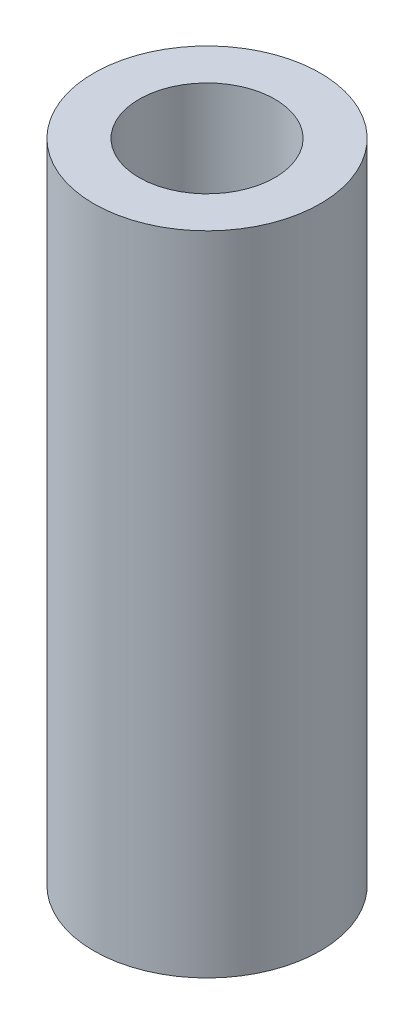
ISO-10303-21;
HEADER;
FILE_DESCRIPTION(('STEP AP214'),'2;1');
FILE_NAME('part.step','',(''),(''),'','','');
FILE_SCHEMA(('AUTOMOTIVE_DESIGN { 1 0 10303 214 1 1 1 1 }'));
ENDSEC;
DATA;
#1=APPLICATION_CONTEXT('core data for automotive mechanical design processes');
#2=APPLICATION_PROTOCOL_DEFINITION('international standard','automotive_design',2000,#1);
#3=PRODUCT_CONTEXT('',#1,'mechanical');
#4=PRODUCT('Part','Part','',(#3));
#5=PRODUCT_RELATED_PRODUCT_CATEGORY('part','',(#4));
#6=PRODUCT_DEFINITION_FORMATION('','',#4);
#7=PRODUCT_DEFINITION_CONTEXT('part definition',#1,'design');
#8=PRODUCT_DEFINITION('design','',#6,#7);
#9=PRODUCT_DEFINITION_SHAPE('','',#8);
#10=(LENGTH_UNIT() NAMED_UNIT(*) SI_UNIT(.MILLI.,.METRE.));
#11=(NAMED_UNIT(*) PLANE_ANGLE_UNIT() SI_UNIT($,.RADIAN.));
#12=(NAMED_UNIT(*) SI_UNIT($,.STERADIAN.) SOLID_ANGLE_UNIT());
#13=UNCERTAINTY_MEASURE_WITH_UNIT(LENGTH_MEASURE(1.E-05),#10,'distance_accuracy_value','');
#14=(GEOMETRIC_REPRESENTATION_CONTEXT(3) GLOBAL_UNCERTAINTY_ASSIGNED_CONTEXT((#13)) GLOBAL_UNIT_ASSIGNED_CONTEXT((#10,
#11,#12)) REPRESENTATION_CONTEXT('',''));
#15=CARTESIAN_POINT('',(0.,0.,0.));
#16=DIRECTION('',(0.,0.,1.));
#17=DIRECTION('',(1.,0.,0.));
#18=AXIS2_PLACEMENT_3D('',#15,#16,#17);
#19=CARTESIAN_POINT('',(0.,20.,0.));
#20=DIRECTION('',(0.,1.,0.));
#21=DIRECTION('',(0.,0.,1.));
#22=AXIS2_PLACEMENT_3D('',#19,#20,#21);
#23=PLANE('',#22);
#24=CARTESIAN_POINT('',(0.,20.,0.));
#25=DIRECTION('',(0.,1.,0.));
#26=DIRECTION('',(0.,0.,1.));
#27=AXIS2_PLACEMENT_3D('',#24,#25,#26);
#28=CIRCLE('',#27,3.5);
#29=CARTESIAN_POINT('',(0.,20.,3.5));
#30=VERTEX_POINT('',#29);
#31=EDGE_CURVE('E10',#30,#30,#28,.T.);
#32=ORIENTED_EDGE('',*,*,#31,.T.);
#33=EDGE_LOOP('',(#32));
#34=FACE_BOUND('',#33,.T.);
#35=CARTESIAN_POINT('',(0.,20.,0.));
#36=DIRECTION('',(0.,1.,0.));
#37=DIRECTION('',(0.,0.,1.));
#38=AXIS2_PLACEMENT_3D('',#35,#36,#37);
#39=CIRCLE('',#38,2.1);
#40=CARTESIAN_POINT('',(0.,20.,2.1));
#41=VERTEX_POINT('',#40);
#42=EDGE_CURVE('E48',#41,#41,#39,.T.);
#43=ORIENTED_EDGE('',*,*,#42,.F.);
#44=EDGE_LOOP('',(#43));
#45=FACE_BOUND('',#44,.T.);
#46=ADVANCED_FACE('F37',(#34,#45),#23,.T.);
#47=CARTESIAN_POINT('',(0.,0.,0.));
#48=DIRECTION('',(0.,1.,0.));
#49=DIRECTION('',(0.,0.,1.));
#50=AXIS2_PLACEMENT_3D('',#47,#48,#49);
#51=PLANE('',#50);
#52=CARTESIAN_POINT('',(0.,0.,0.));
#53=DIRECTION('',(0.,1.,0.));
#54=DIRECTION('',(0.,0.,1.));
#55=AXIS2_PLACEMENT_3D('',#52,#53,#54);
#56=CIRCLE('',#55,3.5);
#57=CARTESIAN_POINT('',(0.,0.,3.5));
#58=VERTEX_POINT('',#57);
#59=EDGE_CURVE('E41',#58,#58,#56,.T.);
#60=ORIENTED_EDGE('',*,*,#59,.F.);
#61=EDGE_LOOP('',(#60));
#62=FACE_BOUND('',#61,.T.);
#63=CARTESIAN_POINT('',(0.,0.,0.));
#64=DIRECTION('',(0.,1.,0.));
#65=DIRECTION('',(0.,0.,1.));
#66=AXIS2_PLACEMENT_3D('',#63,#64,#65);
#67=CIRCLE('',#66,2.1);
#68=CARTESIAN_POINT('',(0.,0.,2.1));
#69=VERTEX_POINT('',#68);
#70=EDGE_CURVE('E50',#69,#69,#67,.T.);
#71=ORIENTED_EDGE('',*,*,#70,.T.);
#72=EDGE_LOOP('',(#71));
#73=FACE_BOUND('',#72,.T.);
#74=ADVANCED_FACE('F60',(#62,#73),#51,.F.);
#75=CARTESIAN_POINT('',(0.,20.,0.));
#76=DIRECTION('',(0.,-1.,0.));
#77=DIRECTION('',(0.,0.,-1.));
#78=AXIS2_PLACEMENT_3D('',#75,#76,#77);
#79=CYLINDRICAL_SURFACE('',#78,3.5);
#80=ORIENTED_EDGE('',*,*,#31,.F.);
#81=EDGE_LOOP('',(#80));
#82=FACE_BOUND('',#81,.T.);
#83=ORIENTED_EDGE('',*,*,#59,.T.);
#84=EDGE_LOOP('',(#83));
#85=FACE_BOUND('',#84,.T.);
#86=ADVANCED_FACE('F39',(#82,#85),#79,.T.);
#87=CARTESIAN_POINT('',(0.,20.,0.));
#88=DIRECTION('',(0.,-1.,0.));
#89=DIRECTION('',(0.,0.,-1.));
#90=AXIS2_PLACEMENT_3D('',#87,#88,#89);
#91=CYLINDRICAL_SURFACE('',#90,2.1);
#92=ORIENTED_EDGE('',*,*,#42,.T.);
#93=EDGE_LOOP('',(#92));
#94=FACE_BOUND('',#93,.T.);
#95=ORIENTED_EDGE('',*,*,#70,.F.);
#96=EDGE_LOOP('',(#95));
#97=FACE_BOUND('',#96,.T.);
#98=ADVANCED_FACE('F56',(#94,#97),#91,.F.);
#99=CLOSED_SHELL('',(#46,#74,#86,#98));
#100=MANIFOLD_SOLID_BREP('B2',#99);
#101=ADVANCED_BREP_SHAPE_REPRESENTATION('',(#18,#100),#14);
#102=SHAPE_DEFINITION_REPRESENTATION(#9,#101);
ENDSEC;
END-ISO-10303-21;
